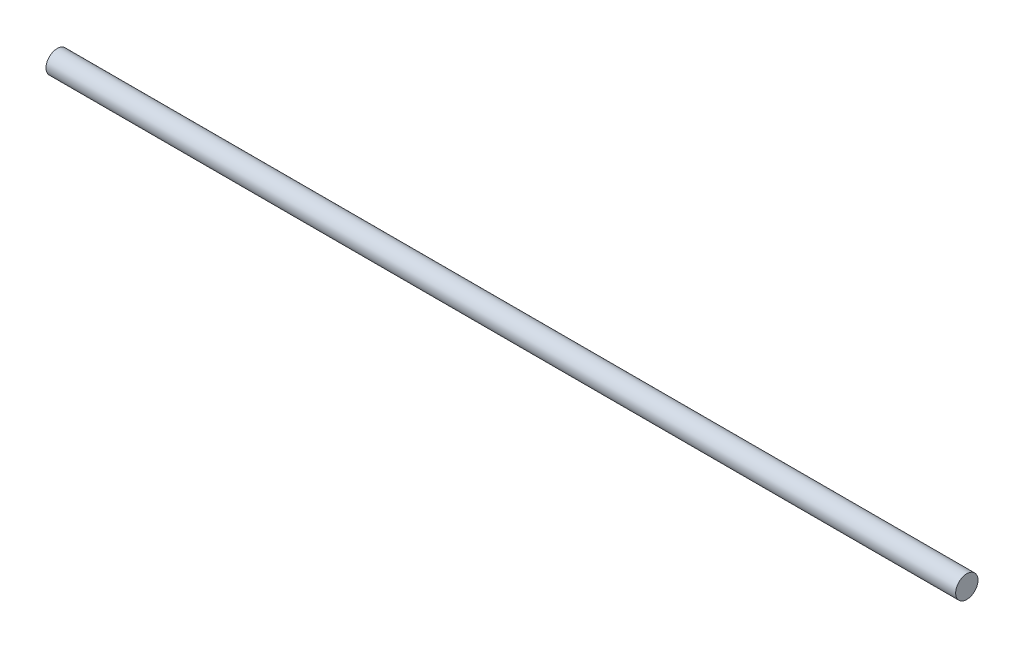
ISO-10303-21;
HEADER;
FILE_DESCRIPTION(('STEP AP214'),'2;1');
FILE_NAME('part.step','',(''),(''),'','','');
FILE_SCHEMA(('AUTOMOTIVE_DESIGN { 1 0 10303 214 1 1 1 1 }'));
ENDSEC;
DATA;
#1=APPLICATION_CONTEXT('core data for automotive mechanical design processes');
#2=APPLICATION_PROTOCOL_DEFINITION('international standard','automotive_design',2000,#1);
#3=PRODUCT_CONTEXT('',#1,'mechanical');
#4=PRODUCT('Part','Part','',(#3));
#5=PRODUCT_RELATED_PRODUCT_CATEGORY('part','',(#4));
#6=PRODUCT_DEFINITION_FORMATION('','',#4);
#7=PRODUCT_DEFINITION_CONTEXT('part definition',#1,'design');
#8=PRODUCT_DEFINITION('design','',#6,#7);
#9=PRODUCT_DEFINITION_SHAPE('','',#8);
#10=(LENGTH_UNIT() NAMED_UNIT(*) SI_UNIT(.MILLI.,.METRE.));
#11=(NAMED_UNIT(*) PLANE_ANGLE_UNIT() SI_UNIT($,.RADIAN.));
#12=(NAMED_UNIT(*) SI_UNIT($,.STERADIAN.) SOLID_ANGLE_UNIT());
#13=UNCERTAINTY_MEASURE_WITH_UNIT(LENGTH_MEASURE(1.E-05),#10,'distance_accuracy_value','');
#14=(GEOMETRIC_REPRESENTATION_CONTEXT(3) GLOBAL_UNCERTAINTY_ASSIGNED_CONTEXT((#13)) GLOBAL_UNIT_ASSIGNED_CONTEXT((#10,
#11,#12)) REPRESENTATION_CONTEXT('',''));
#15=CARTESIAN_POINT('',(0.,0.,0.));
#16=DIRECTION('',(0.,0.,1.));
#17=DIRECTION('',(1.,0.,0.));
#18=AXIS2_PLACEMENT_3D('',#15,#16,#17);
#19=CARTESIAN_POINT('',(-11.,0.,0.));
#20=DIRECTION('',(1.,0.,0.));
#21=DIRECTION('',(0.,0.,-1.));
#22=AXIS2_PLACEMENT_3D('',#19,#20,#21);
#23=CYLINDRICAL_SURFACE('',#22,0.750000000000001);
#24=CARTESIAN_POINT('',(-11.,0.,0.));
#25=DIRECTION('',(1.,0.,0.));
#26=DIRECTION('',(0.,0.,-1.));
#27=AXIS2_PLACEMENT_3D('',#24,#25,#26);
#28=CIRCLE('',#27,0.750000000000001);
#29=CARTESIAN_POINT('',(-11.,0.,-0.750000000000001));
#30=VERTEX_POINT('',#29);
#31=EDGE_CURVE('E10',#30,#30,#28,.T.);
#32=ORIENTED_EDGE('',*,*,#31,.T.);
#33=EDGE_LOOP('',(#32));
#34=FACE_BOUND('',#33,.T.);
#35=CARTESIAN_POINT('',(50.,0.,0.));
#36=DIRECTION('',(1.,0.,0.));
#37=DIRECTION('',(0.,0.,-1.));
#38=AXIS2_PLACEMENT_3D('',#35,#36,#37);
#39=CIRCLE('',#38,0.750000000000001);
#40=CARTESIAN_POINT('',(50.,0.,-0.750000000000001));
#41=VERTEX_POINT('',#40);
#42=EDGE_CURVE('E39',#41,#41,#39,.T.);
#43=ORIENTED_EDGE('',*,*,#42,.F.);
#44=EDGE_LOOP('',(#43));
#45=FACE_BOUND('',#44,.T.);
#46=ADVANCED_FACE('F33',(#34,#45),#23,.T.);
#47=CARTESIAN_POINT('',(-11.,0.,0.));
#48=DIRECTION('',(1.,0.,0.));
#49=DIRECTION('',(0.,0.,-1.));
#50=AXIS2_PLACEMENT_3D('',#47,#48,#49);
#51=PLANE('',#50);
#52=ORIENTED_EDGE('',*,*,#31,.F.);
#53=EDGE_LOOP('',(#52));
#54=FACE_BOUND('',#53,.T.);
#55=ADVANCED_FACE('F48',(#54),#51,.F.);
#56=CARTESIAN_POINT('',(50.,0.,0.));
#57=DIRECTION('',(1.,0.,0.));
#58=DIRECTION('',(0.,0.,-1.));
#59=AXIS2_PLACEMENT_3D('',#56,#57,#58);
#60=PLANE('',#59);
#61=ORIENTED_EDGE('',*,*,#42,.T.);
#62=EDGE_LOOP('',(#61));
#63=FACE_BOUND('',#62,.T.);
#64=ADVANCED_FACE('F45',(#63),#60,.T.);
#65=CLOSED_SHELL('',(#46,#55,#64));
#66=MANIFOLD_SOLID_BREP('B2',#65);
#67=ADVANCED_BREP_SHAPE_REPRESENTATION('',(#18,#66),#14);
#68=SHAPE_DEFINITION_REPRESENTATION(#9,#67);
ENDSEC;
END-ISO-10303-21;
